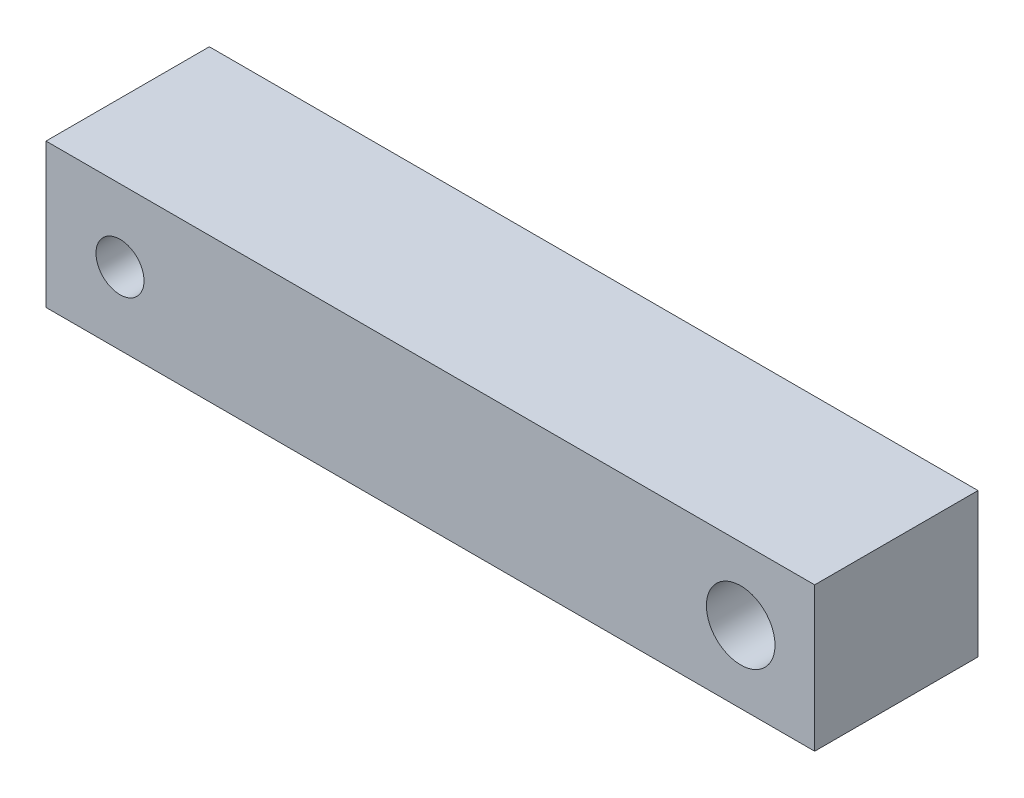
ISO-10303-21;
HEADER;
FILE_DESCRIPTION(('STEP AP214'),'2;1');
FILE_NAME('part.step','',(''),(''),'','','');
FILE_SCHEMA(('AUTOMOTIVE_DESIGN { 1 0 10303 214 1 1 1 1 }'));
ENDSEC;
DATA;
#1=APPLICATION_CONTEXT('core data for automotive mechanical design processes');
#2=APPLICATION_PROTOCOL_DEFINITION('international standard','automotive_design',2000,#1);
#3=PRODUCT_CONTEXT('',#1,'mechanical');
#4=PRODUCT('Part','Part','',(#3));
#5=PRODUCT_RELATED_PRODUCT_CATEGORY('part','',(#4));
#6=PRODUCT_DEFINITION_FORMATION('','',#4);
#7=PRODUCT_DEFINITION_CONTEXT('part definition',#1,'design');
#8=PRODUCT_DEFINITION('design','',#6,#7);
#9=PRODUCT_DEFINITION_SHAPE('','',#8);
#10=(LENGTH_UNIT() NAMED_UNIT(*) SI_UNIT(.MILLI.,.METRE.));
#11=(NAMED_UNIT(*) PLANE_ANGLE_UNIT() SI_UNIT($,.RADIAN.));
#12=(NAMED_UNIT(*) SI_UNIT($,.STERADIAN.) SOLID_ANGLE_UNIT());
#13=UNCERTAINTY_MEASURE_WITH_UNIT(LENGTH_MEASURE(1.E-05),#10,'distance_accuracy_value','');
#14=(GEOMETRIC_REPRESENTATION_CONTEXT(3) GLOBAL_UNCERTAINTY_ASSIGNED_CONTEXT((#13)) GLOBAL_UNIT_ASSIGNED_CONTEXT((#10,
#11,#12)) REPRESENTATION_CONTEXT('',''));
#15=CARTESIAN_POINT('',(0.,0.,0.));
#16=DIRECTION('',(0.,0.,1.));
#17=DIRECTION('',(1.,0.,0.));
#18=AXIS2_PLACEMENT_3D('',#15,#16,#17);
#19=CARTESIAN_POINT('',(0.,0.,27.));
#20=DIRECTION('',(0.,0.,-1.));
#21=DIRECTION('',(-1.,0.,0.));
#22=AXIS2_PLACEMENT_3D('',#19,#20,#21);
#23=PLANE('',#22);
#24=CARTESIAN_POINT('',(32.2999999999999,33.2308657440665,27.));
#25=DIRECTION('',(0.,0.,1.));
#26=DIRECTION('',(1.,0.,0.));
#27=AXIS2_PLACEMENT_3D('',#24,#25,#26);
#28=CIRCLE('',#27,3.57);
#29=CARTESIAN_POINT('',(35.8699999999999,33.2308657440665,27.));
#30=VERTEX_POINT('',#29);
#31=EDGE_CURVE('E100',#30,#30,#28,.T.);
#32=ORIENTED_EDGE('',*,*,#31,.F.);
#33=EDGE_LOOP('',(#32));
#34=FACE_BOUND('',#33,.T.);
#35=DIRECTION('',(0.,-1.,0.));
#36=VECTOR('',#35,1.);
#37=CARTESIAN_POINT('',(-40.,40.7308657440116,27.));
#38=LINE('',#37,#36);
#39=CARTESIAN_POINT('',(-40.,40.7308657440116,27.));
#40=VERTEX_POINT('',#39);
#41=CARTESIAN_POINT('',(-40.,25.7308657440116,27.));
#42=VERTEX_POINT('',#41);
#43=EDGE_CURVE('E85',#40,#42,#38,.T.);
#44=ORIENTED_EDGE('',*,*,#43,.T.);
#45=DIRECTION('',(1.,0.,0.));
#46=VECTOR('',#45,1.);
#47=CARTESIAN_POINT('',(40.,25.7308657440116,27.));
#48=LINE('',#47,#46);
#49=CARTESIAN_POINT('',(40.,25.7308657440116,27.));
#50=VERTEX_POINT('',#49);
#51=EDGE_CURVE('E80',#42,#50,#48,.T.);
#52=ORIENTED_EDGE('',*,*,#51,.T.);
#53=DIRECTION('',(0.,1.,0.));
#54=VECTOR('',#53,1.);
#55=CARTESIAN_POINT('',(40.,40.7308657440116,27.));
#56=LINE('',#55,#54);
#57=CARTESIAN_POINT('',(40.,40.7308657440116,27.));
#58=VERTEX_POINT('',#57);
#59=EDGE_CURVE('E83',#50,#58,#56,.T.);
#60=ORIENTED_EDGE('',*,*,#59,.T.);
#61=DIRECTION('',(-1.,0.,0.));
#62=VECTOR('',#61,1.);
#63=CARTESIAN_POINT('',(40.,40.7308657440116,27.));
#64=LINE('',#63,#62);
#65=EDGE_CURVE('E50',#58,#40,#64,.T.);
#66=ORIENTED_EDGE('',*,*,#65,.T.);
#67=EDGE_LOOP('',(#44,#52,#60,#66));
#68=FACE_BOUND('',#67,.T.);
#69=CARTESIAN_POINT('',(-32.3000000000001,33.2308657440116,27.));
#70=DIRECTION('',(0.,0.,1.));
#71=DIRECTION('',(1.,0.,0.));
#72=AXIS2_PLACEMENT_3D('',#69,#70,#71);
#73=CIRCLE('',#72,2.5);
#74=CARTESIAN_POINT('',(-29.8000000000001,33.2308657440116,27.));
#75=VERTEX_POINT('',#74);
#76=EDGE_CURVE('E115',#75,#75,#73,.T.);
#77=ORIENTED_EDGE('',*,*,#76,.F.);
#78=EDGE_LOOP('',(#77));
#79=FACE_BOUND('',#78,.T.);
#80=ADVANCED_FACE('F33',(#34,#68,#79),#23,.F.);
#81=CARTESIAN_POINT('',(0.,0.,10.));
#82=DIRECTION('',(0.,0.,-1.));
#83=DIRECTION('',(-1.,0.,0.));
#84=AXIS2_PLACEMENT_3D('',#81,#82,#83);
#85=PLANE('',#84);
#86=CARTESIAN_POINT('',(32.2999999999999,33.2308657440665,10.));
#87=DIRECTION('',(0.,0.,1.));
#88=DIRECTION('',(1.,0.,0.));
#89=AXIS2_PLACEMENT_3D('',#86,#87,#88);
#90=CIRCLE('',#89,3.57);
#91=CARTESIAN_POINT('',(35.8699999999999,33.2308657440665,10.));
#92=VERTEX_POINT('',#91);
#93=EDGE_CURVE('E112',#92,#92,#90,.T.);
#94=ORIENTED_EDGE('',*,*,#93,.T.);
#95=EDGE_LOOP('',(#94));
#96=FACE_BOUND('',#95,.T.);
#97=DIRECTION('',(0.,-1.,0.));
#98=VECTOR('',#97,1.);
#99=CARTESIAN_POINT('',(-40.,40.7308657440116,10.));
#100=LINE('',#99,#98);
#101=CARTESIAN_POINT('',(-40.,40.7308657440116,10.));
#102=VERTEX_POINT('',#101);
#103=CARTESIAN_POINT('',(-40.,25.7308657440116,10.));
#104=VERTEX_POINT('',#103);
#105=EDGE_CURVE('E97',#102,#104,#100,.T.);
#106=ORIENTED_EDGE('',*,*,#105,.F.);
#107=DIRECTION('',(-1.,0.,0.));
#108=VECTOR('',#107,1.);
#109=CARTESIAN_POINT('',(40.,40.7308657440116,10.));
#110=LINE('',#109,#108);
#111=CARTESIAN_POINT('',(40.,40.7308657440116,10.));
#112=VERTEX_POINT('',#111);
#113=EDGE_CURVE('E73',#112,#102,#110,.T.);
#114=ORIENTED_EDGE('',*,*,#113,.F.);
#115=DIRECTION('',(0.,1.,0.));
#116=VECTOR('',#115,1.);
#117=CARTESIAN_POINT('',(40.,40.7308657440116,10.));
#118=LINE('',#117,#116);
#119=CARTESIAN_POINT('',(40.,25.7308657440116,10.));
#120=VERTEX_POINT('',#119);
#121=EDGE_CURVE('E67',#120,#112,#118,.T.);
#122=ORIENTED_EDGE('',*,*,#121,.F.);
#123=DIRECTION('',(1.,0.,0.));
#124=VECTOR('',#123,1.);
#125=CARTESIAN_POINT('',(40.,25.7308657440116,10.));
#126=LINE('',#125,#124);
#127=EDGE_CURVE('E89',#104,#120,#126,.T.);
#128=ORIENTED_EDGE('',*,*,#127,.F.);
#129=EDGE_LOOP('',(#106,#114,#122,#128));
#130=FACE_BOUND('',#129,.T.);
#131=CARTESIAN_POINT('',(-32.3000000000001,33.2308657440116,10.));
#132=DIRECTION('',(0.,0.,1.));
#133=DIRECTION('',(1.,0.,0.));
#134=AXIS2_PLACEMENT_3D('',#131,#132,#133);
#135=CIRCLE('',#134,2.5);
#136=CARTESIAN_POINT('',(-29.8000000000001,33.2308657440116,10.));
#137=VERTEX_POINT('',#136);
#138=EDGE_CURVE('E118',#137,#137,#135,.T.);
#139=ORIENTED_EDGE('',*,*,#138,.T.);
#140=EDGE_LOOP('',(#139));
#141=FACE_BOUND('',#140,.T.);
#142=ADVANCED_FACE('F108',(#96,#130,#141),#85,.T.);
#143=CARTESIAN_POINT('',(-40.,40.7308657440116,27.));
#144=DIRECTION('',(1.,0.,0.));
#145=DIRECTION('',(0.,0.,-1.));
#146=AXIS2_PLACEMENT_3D('',#143,#144,#145);
#147=PLANE('',#146);
#148=ORIENTED_EDGE('',*,*,#105,.T.);
#149=DIRECTION('',(0.,0.,-1.));
#150=VECTOR('',#149,1.);
#151=CARTESIAN_POINT('',(-40.,25.7308657440116,27.));
#152=LINE('',#151,#150);
#153=EDGE_CURVE('E11',#42,#104,#152,.T.);
#154=ORIENTED_EDGE('',*,*,#153,.F.);
#155=ORIENTED_EDGE('',*,*,#43,.F.);
#156=DIRECTION('',(0.,0.,-1.));
#157=VECTOR('',#156,1.);
#158=CARTESIAN_POINT('',(-40.,40.7308657440116,27.));
#159=LINE('',#158,#157);
#160=EDGE_CURVE('E93',#40,#102,#159,.T.);
#161=ORIENTED_EDGE('',*,*,#160,.T.);
#162=EDGE_LOOP('',(#148,#154,#155,#161));
#163=FACE_BOUND('',#162,.T.);
#164=ADVANCED_FACE('F35',(#163),#147,.F.);
#165=CARTESIAN_POINT('',(40.,25.7308657440116,27.));
#166=DIRECTION('',(0.,1.,0.));
#167=DIRECTION('',(-1.,0.,0.));
#168=AXIS2_PLACEMENT_3D('',#165,#166,#167);
#169=PLANE('',#168);
#170=ORIENTED_EDGE('',*,*,#127,.T.);
#171=DIRECTION('',(0.,0.,-1.));
#172=VECTOR('',#171,1.);
#173=CARTESIAN_POINT('',(40.,25.7308657440116,27.));
#174=LINE('',#173,#172);
#175=EDGE_CURVE('E42',#50,#120,#174,.T.);
#176=ORIENTED_EDGE('',*,*,#175,.F.);
#177=ORIENTED_EDGE('',*,*,#51,.F.);
#178=ORIENTED_EDGE('',*,*,#153,.T.);
#179=EDGE_LOOP('',(#170,#176,#177,#178));
#180=FACE_BOUND('',#179,.T.);
#181=ADVANCED_FACE('F88',(#180),#169,.F.);
#182=CARTESIAN_POINT('',(40.,40.7308657440116,27.));
#183=DIRECTION('',(-1.,0.,0.));
#184=DIRECTION('',(0.,0.,1.));
#185=AXIS2_PLACEMENT_3D('',#182,#183,#184);
#186=PLANE('',#185);
#187=ORIENTED_EDGE('',*,*,#121,.T.);
#188=DIRECTION('',(0.,0.,-1.));
#189=VECTOR('',#188,1.);
#190=CARTESIAN_POINT('',(40.,40.7308657440116,27.));
#191=LINE('',#190,#189);
#192=EDGE_CURVE('E90',#58,#112,#191,.T.);
#193=ORIENTED_EDGE('',*,*,#192,.F.);
#194=ORIENTED_EDGE('',*,*,#59,.F.);
#195=ORIENTED_EDGE('',*,*,#175,.T.);
#196=EDGE_LOOP('',(#187,#193,#194,#195));
#197=FACE_BOUND('',#196,.T.);
#198=ADVANCED_FACE('F91',(#197),#186,.F.);
#199=CARTESIAN_POINT('',(40.,40.7308657440116,27.));
#200=DIRECTION('',(0.,-1.,0.));
#201=DIRECTION('',(1.,0.,0.));
#202=AXIS2_PLACEMENT_3D('',#199,#200,#201);
#203=PLANE('',#202);
#204=ORIENTED_EDGE('',*,*,#113,.T.);
#205=ORIENTED_EDGE('',*,*,#160,.F.);
#206=ORIENTED_EDGE('',*,*,#65,.F.);
#207=ORIENTED_EDGE('',*,*,#192,.T.);
#208=EDGE_LOOP('',(#204,#205,#206,#207));
#209=FACE_BOUND('',#208,.T.);
#210=ADVANCED_FACE('F105',(#209),#203,.F.);
#211=CARTESIAN_POINT('',(32.2999999999999,33.2308657440665,27.));
#212=DIRECTION('',(0.,0.,-1.));
#213=DIRECTION('',(-1.,0.,0.));
#214=AXIS2_PLACEMENT_3D('',#211,#212,#213);
#215=CYLINDRICAL_SURFACE('',#214,3.57);
#216=ORIENTED_EDGE('',*,*,#31,.T.);
#217=EDGE_LOOP('',(#216));
#218=FACE_BOUND('',#217,.T.);
#219=ORIENTED_EDGE('',*,*,#93,.F.);
#220=EDGE_LOOP('',(#219));
#221=FACE_BOUND('',#220,.T.);
#222=ADVANCED_FACE('F136',(#218,#221),#215,.F.);
#223=CARTESIAN_POINT('',(-32.3000000000001,33.2308657440116,27.));
#224=DIRECTION('',(0.,0.,-1.));
#225=DIRECTION('',(-1.,0.,0.));
#226=AXIS2_PLACEMENT_3D('',#223,#224,#225);
#227=CYLINDRICAL_SURFACE('',#226,2.5);
#228=ORIENTED_EDGE('',*,*,#76,.T.);
#229=EDGE_LOOP('',(#228));
#230=FACE_BOUND('',#229,.T.);
#231=ORIENTED_EDGE('',*,*,#138,.F.);
#232=EDGE_LOOP('',(#231));
#233=FACE_BOUND('',#232,.T.);
#234=ADVANCED_FACE('F124',(#230,#233),#227,.F.);
#235=CLOSED_SHELL('',(#80,#142,#164,#181,#198,#210,#222,#234));
#236=MANIFOLD_SOLID_BREP('B2',#235);
#237=ADVANCED_BREP_SHAPE_REPRESENTATION('',(#18,#236),#14);
#238=SHAPE_DEFINITION_REPRESENTATION(#9,#237);
ENDSEC;
END-ISO-10303-21;
